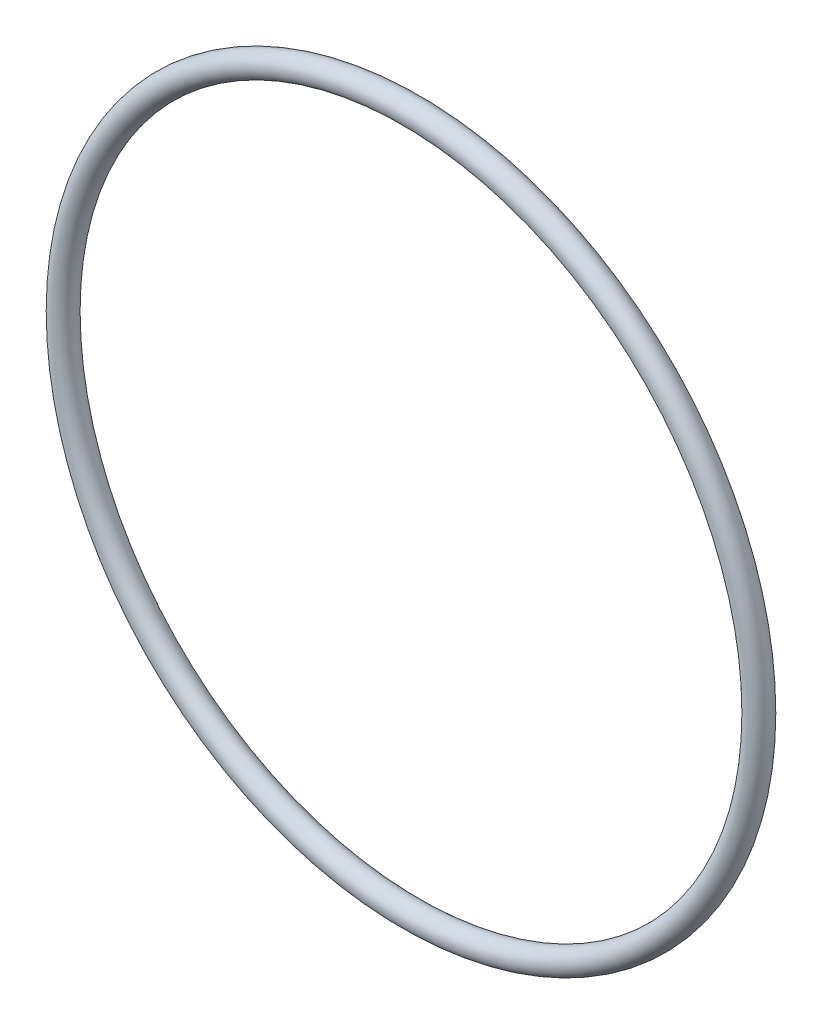
ISO-10303-21;
HEADER;
FILE_DESCRIPTION(('STEP AP214'),'2;1');
FILE_NAME('part.step','',(''),(''),'','','');
FILE_SCHEMA(('AUTOMOTIVE_DESIGN { 1 0 10303 214 1 1 1 1 }'));
ENDSEC;
DATA;
#1=APPLICATION_CONTEXT('core data for automotive mechanical design processes');
#2=APPLICATION_PROTOCOL_DEFINITION('international standard','automotive_design',2000,#1);
#3=PRODUCT_CONTEXT('',#1,'mechanical');
#4=PRODUCT('Part','Part','',(#3));
#5=PRODUCT_RELATED_PRODUCT_CATEGORY('part','',(#4));
#6=PRODUCT_DEFINITION_FORMATION('','',#4);
#7=PRODUCT_DEFINITION_CONTEXT('part definition',#1,'design');
#8=PRODUCT_DEFINITION('design','',#6,#7);
#9=PRODUCT_DEFINITION_SHAPE('','',#8);
#10=(LENGTH_UNIT() NAMED_UNIT(*) SI_UNIT(.MILLI.,.METRE.));
#11=(NAMED_UNIT(*) PLANE_ANGLE_UNIT() SI_UNIT($,.RADIAN.));
#12=(NAMED_UNIT(*) SI_UNIT($,.STERADIAN.) SOLID_ANGLE_UNIT());
#13=UNCERTAINTY_MEASURE_WITH_UNIT(LENGTH_MEASURE(1.E-05),#10,'distance_accuracy_value','');
#14=(GEOMETRIC_REPRESENTATION_CONTEXT(3) GLOBAL_UNCERTAINTY_ASSIGNED_CONTEXT((#13)) GLOBAL_UNIT_ASSIGNED_CONTEXT((#10,
#11,#12)) REPRESENTATION_CONTEXT('',''));
#15=CARTESIAN_POINT('',(0.,0.,0.));
#16=DIRECTION('',(0.,0.,1.));
#17=DIRECTION('',(1.,0.,0.));
#18=AXIS2_PLACEMENT_3D('',#15,#16,#17);
#19=CARTESIAN_POINT('',(0.,0.,0.));
#20=DIRECTION('',(0.,0.,-1.));
#21=DIRECTION('',(-1.,0.,0.));
#22=AXIS2_PLACEMENT_3D('',#19,#20,#21);
#23=TOROIDAL_SURFACE('',#22,29.,1.);
#24=CARTESIAN_POINT('',(-30.,0.,0.));
#25=VERTEX_POINT('',#24);
#26=VERTEX_LOOP('',#25);
#27=FACE_BOUND('',#26,.T.);
#28=ADVANCED_FACE('F33',(#27),#23,.T.);
#29=CLOSED_SHELL('',(#28));
#30=MANIFOLD_SOLID_BREP('B2',#29);
#31=ADVANCED_BREP_SHAPE_REPRESENTATION('',(#18,#30),#14);
#32=SHAPE_DEFINITION_REPRESENTATION(#9,#31);
ENDSEC;
END-ISO-10303-21;
